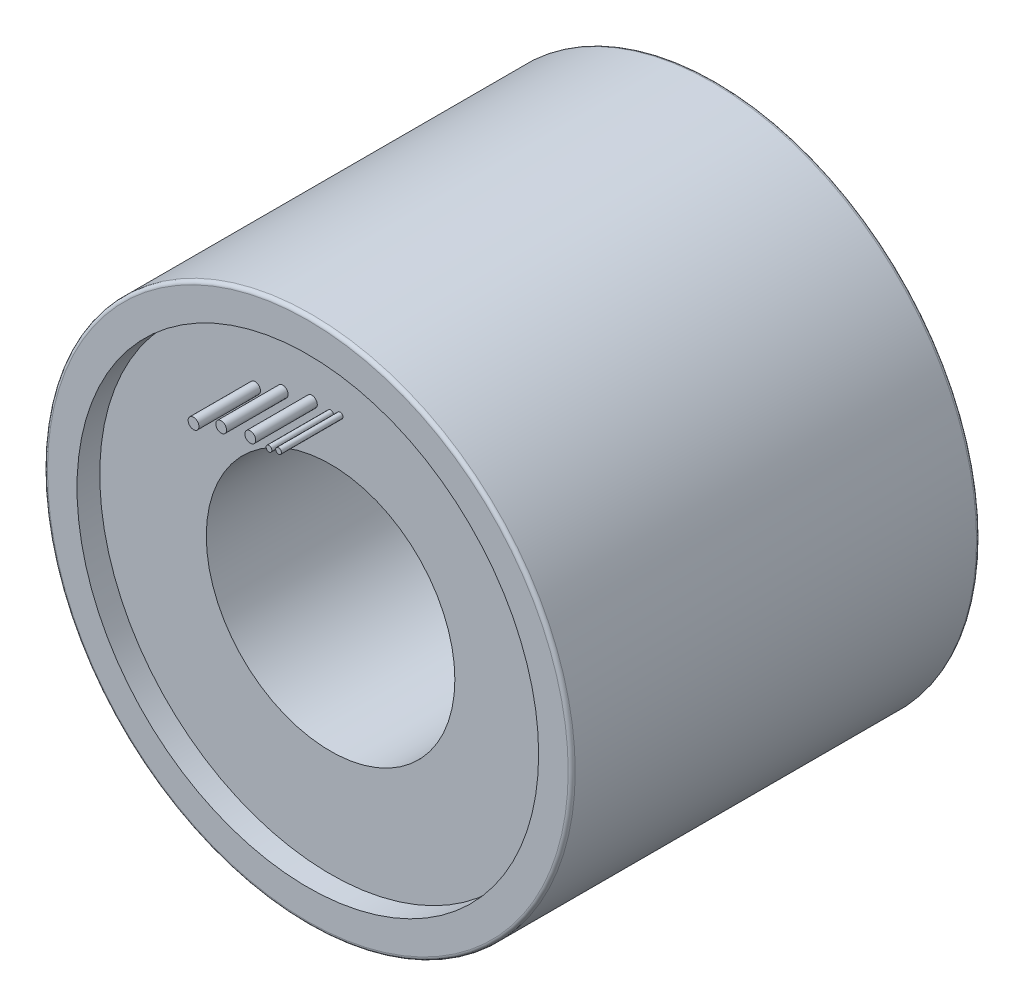
ISO-10303-21;
HEADER;
FILE_DESCRIPTION(('STEP AP214'),'2;1');
FILE_NAME('part.step','',(''),(''),'','','');
FILE_SCHEMA(('AUTOMOTIVE_DESIGN { 1 0 10303 214 1 1 1 1 }'));
ENDSEC;
DATA;
#1=APPLICATION_CONTEXT('core data for automotive mechanical design processes');
#2=APPLICATION_PROTOCOL_DEFINITION('international standard','automotive_design',2000,#1);
#3=PRODUCT_CONTEXT('',#1,'mechanical');
#4=PRODUCT('Part','Part','',(#3));
#5=PRODUCT_RELATED_PRODUCT_CATEGORY('part','',(#4));
#6=PRODUCT_DEFINITION_FORMATION('','',#4);
#7=PRODUCT_DEFINITION_CONTEXT('part definition',#1,'design');
#8=PRODUCT_DEFINITION('design','',#6,#7);
#9=PRODUCT_DEFINITION_SHAPE('','',#8);
#10=(LENGTH_UNIT() NAMED_UNIT(*) SI_UNIT(.MILLI.,.METRE.));
#11=(NAMED_UNIT(*) PLANE_ANGLE_UNIT() SI_UNIT($,.RADIAN.));
#12=(NAMED_UNIT(*) SI_UNIT($,.STERADIAN.) SOLID_ANGLE_UNIT());
#13=UNCERTAINTY_MEASURE_WITH_UNIT(LENGTH_MEASURE(1.E-05),#10,'distance_accuracy_value','');
#14=(GEOMETRIC_REPRESENTATION_CONTEXT(3) GLOBAL_UNCERTAINTY_ASSIGNED_CONTEXT((#13)) GLOBAL_UNIT_ASSIGNED_CONTEXT((#10,
#11,#12)) REPRESENTATION_CONTEXT('',''));
#15=CARTESIAN_POINT('',(0.,0.,0.));
#16=DIRECTION('',(0.,0.,1.));
#17=DIRECTION('',(1.,0.,0.));
#18=AXIS2_PLACEMENT_3D('',#15,#16,#17);
#19=CARTESIAN_POINT('',(0.,0.,58.));
#20=DIRECTION('',(0.,0.,-1.));
#21=DIRECTION('',(-1.,0.,0.));
#22=AXIS2_PLACEMENT_3D('',#19,#20,#21);
#23=CYLINDRICAL_SURFACE('',#22,37.4815);
#24=CARTESIAN_POINT('',(0.,0.,57.5));
#25=DIRECTION('',(0.,0.,1.));
#26=DIRECTION('',(1.,0.,0.));
#27=AXIS2_PLACEMENT_3D('',#24,#25,#26);
#28=CIRCLE('',#27,37.4815);
#29=CARTESIAN_POINT('',(-37.4815,0.,57.5));
#30=VERTEX_POINT('',#29);
#31=EDGE_CURVE('E42',#30,#30,#28,.F.);
#32=CARTESIAN_POINT('',(0.,0.,0.5));
#33=DIRECTION('',(0.,0.,1.));
#34=DIRECTION('',(1.,0.,0.));
#35=AXIS2_PLACEMENT_3D('',#32,#33,#34);
#36=CIRCLE('',#35,37.4815);
#37=CARTESIAN_POINT('',(-37.4815,0.,0.5));
#38=VERTEX_POINT('',#37);
#39=EDGE_CURVE('E46',#38,#38,#36,.T.);
#40=CARTESIAN_POINT('',(-37.4815,0.,57.5));
#41=CARTESIAN_POINT('',(-37.4815,0.,56.90625));
#42=CARTESIAN_POINT('',(-37.4815,0.,56.3125));
#43=CARTESIAN_POINT('',(-37.4815,0.,55.125));
#44=CARTESIAN_POINT('',(-37.4815,0.,54.53125));
#45=CARTESIAN_POINT('',(-37.4815,0.,53.34375));
#46=CARTESIAN_POINT('',(-37.4815,0.,52.75));
#47=CARTESIAN_POINT('',(-37.4815,0.,51.5625));
#48=CARTESIAN_POINT('',(-37.4815,0.,50.96875));
#49=CARTESIAN_POINT('',(-37.4815,0.,49.78125));
#50=CARTESIAN_POINT('',(-37.4815,0.,49.1875));
#51=CARTESIAN_POINT('',(-37.4815,0.,48.));
#52=CARTESIAN_POINT('',(-37.4815,0.,47.40625));
#53=CARTESIAN_POINT('',(-37.4815,0.,46.21875));
#54=CARTESIAN_POINT('',(-37.4815,0.,45.625));
#55=CARTESIAN_POINT('',(-37.4815,0.,44.4375));
#56=CARTESIAN_POINT('',(-37.4815,0.,43.84375));
#57=CARTESIAN_POINT('',(-37.4815,0.,42.65625));
#58=CARTESIAN_POINT('',(-37.4815,0.,42.0625));
#59=CARTESIAN_POINT('',(-37.4815,0.,40.875));
#60=CARTESIAN_POINT('',(-37.4815,0.,40.28125));
#61=CARTESIAN_POINT('',(-37.4815,0.,39.09375));
#62=CARTESIAN_POINT('',(-37.4815,0.,38.5));
#63=CARTESIAN_POINT('',(-37.4815,0.,37.3125));
#64=CARTESIAN_POINT('',(-37.4815,0.,36.71875));
#65=CARTESIAN_POINT('',(-37.4815,0.,35.53125));
#66=CARTESIAN_POINT('',(-37.4815,0.,34.9375));
#67=CARTESIAN_POINT('',(-37.4815,0.,33.75));
#68=CARTESIAN_POINT('',(-37.4815,0.,33.15625));
#69=CARTESIAN_POINT('',(-37.4815,0.,31.96875));
#70=CARTESIAN_POINT('',(-37.4815,0.,31.375));
#71=CARTESIAN_POINT('',(-37.4815,0.,30.1875));
#72=CARTESIAN_POINT('',(-37.4815,0.,29.59375));
#73=CARTESIAN_POINT('',(-37.4815,0.,28.40625));
#74=CARTESIAN_POINT('',(-37.4815,0.,27.8125));
#75=CARTESIAN_POINT('',(-37.4815,0.,26.625));
#76=CARTESIAN_POINT('',(-37.4815,0.,26.03125));
#77=CARTESIAN_POINT('',(-37.4815,0.,24.84375));
#78=CARTESIAN_POINT('',(-37.4815,0.,24.25));
#79=CARTESIAN_POINT('',(-37.4815,0.,23.0625));
#80=CARTESIAN_POINT('',(-37.4815,0.,22.46875));
#81=CARTESIAN_POINT('',(-37.4815,0.,21.28125));
#82=CARTESIAN_POINT('',(-37.4815,0.,20.6875));
#83=CARTESIAN_POINT('',(-37.4815,0.,19.5));
#84=CARTESIAN_POINT('',(-37.4815,0.,18.90625));
#85=CARTESIAN_POINT('',(-37.4815,0.,17.71875));
#86=CARTESIAN_POINT('',(-37.4815,0.,17.125));
#87=CARTESIAN_POINT('',(-37.4815,0.,15.9375));
#88=CARTESIAN_POINT('',(-37.4815,0.,15.34375));
#89=CARTESIAN_POINT('',(-37.4815,0.,14.15625));
#90=CARTESIAN_POINT('',(-37.4815,0.,13.5625));
#91=CARTESIAN_POINT('',(-37.4815,0.,12.375));
#92=CARTESIAN_POINT('',(-37.4815,0.,11.78125));
#93=CARTESIAN_POINT('',(-37.4815,0.,10.59375));
#94=CARTESIAN_POINT('',(-37.4815,0.,10.));
#95=CARTESIAN_POINT('',(-37.4815,0.,8.8125));
#96=CARTESIAN_POINT('',(-37.4815,0.,8.21875));
#97=CARTESIAN_POINT('',(-37.4815,0.,7.03124999999999));
#98=CARTESIAN_POINT('',(-37.4815,0.,6.43749999999999));
#99=CARTESIAN_POINT('',(-37.4815,0.,5.25));
#100=CARTESIAN_POINT('',(-37.4815,0.,4.65625));
#101=CARTESIAN_POINT('',(-37.4815,0.,3.46875));
#102=CARTESIAN_POINT('',(-37.4815,0.,2.875));
#103=CARTESIAN_POINT('',(-37.4815,0.,1.6875));
#104=CARTESIAN_POINT('',(-37.4815,0.,1.09375));
#105=CARTESIAN_POINT('',(-37.4815,0.,0.5));
#106=B_SPLINE_CURVE_WITH_KNOTS('',3,(#40,#41,#42,#43,#44,#45,#46,#47,#48,#49,#50,#51,#52,#53,
#54,#55,#56,#57,#58,#59,#60,#61,#62,#63,#64,#65,#66,#67,#68,#69,#70,#71,#72,#73,#74,#75,#76,#77,
#78,#79,#80,#81,#82,#83,#84,#85,#86,#87,#88,#89,#90,#91,#92,#93,#94,#95,#96,#97,#98,#99,#100,
#101,#102,#103,#104,#105),.UNSPECIFIED.,.F.,.F.,(4,2,2,2,2,2,2,2,2,2,2,2,2,2,2,2,2,2,2,2,2,2,2,
2,2,2,2,2,2,2,2,2,4),(0.,1.78125000000001,3.5625,5.34375,7.12500000000001,8.90625,10.6875,
12.46875,14.25,16.03125,17.8125,19.59375,21.375,23.15625,24.9375,26.71875,28.5,30.28125,32.0625,
33.84375,35.625,37.40625,39.1875,40.96875,42.75,44.53125,46.3125,48.09375,49.875,51.65625,
53.4375,55.21875,57.),.UNSPECIFIED.);
#107=EDGE_CURVE('BSEAM35',#30,#38,#106,.T.);
#108=ORIENTED_EDGE('',*,*,#31,.T.);
#109=ORIENTED_EDGE('',*,*,#39,.T.);
#110=ORIENTED_EDGE('',*,*,#107,.T.);
#111=ORIENTED_EDGE('',*,*,#107,.F.);
#112=EDGE_LOOP('',(#108,#110,#109,#111));
#113=FACE_BOUND('',#112,.T.);
#114=ADVANCED_FACE('F35',(#113),#23,.T.);
#115=CARTESIAN_POINT('',(0.,0.,58.));
#116=DIRECTION('',(0.,0.,1.));
#117=DIRECTION('',(1.,0.,0.));
#118=AXIS2_PLACEMENT_3D('',#115,#116,#117);
#119=PLANE('',#118);
#120=CARTESIAN_POINT('',(0.,0.,58.));
#121=DIRECTION('',(0.,0.,1.));
#122=DIRECTION('',(1.,0.,0.));
#123=AXIS2_PLACEMENT_3D('',#120,#121,#122);
#124=CIRCLE('',#123,36.9815);
#125=CARTESIAN_POINT('',(36.9815,0.,58.));
#126=VERTEX_POINT('',#125);
#127=EDGE_CURVE('E50',#126,#126,#124,.T.);
#128=ORIENTED_EDGE('',*,*,#127,.T.);
#129=EDGE_LOOP('',(#128));
#130=FACE_BOUND('',#129,.T.);
#131=CARTESIAN_POINT('',(0.,0.,58.));
#132=DIRECTION('',(0.,0.,1.));
#133=DIRECTION('',(1.,0.,0.));
#134=AXIS2_PLACEMENT_3D('',#131,#132,#133);
#135=CIRCLE('',#134,32.785);
#136=CARTESIAN_POINT('',(32.785,0.,58.));
#137=VERTEX_POINT('',#136);
#138=EDGE_CURVE('E59',#137,#137,#135,.T.);
#139=ORIENTED_EDGE('',*,*,#138,.F.);
#140=EDGE_LOOP('',(#139));
#141=FACE_BOUND('',#140,.T.);
#142=ADVANCED_FACE('F137',(#130,#141),#119,.T.);
#143=CARTESIAN_POINT('',(0.,0.,0.));
#144=DIRECTION('',(0.,0.,1.));
#145=DIRECTION('',(1.,0.,0.));
#146=AXIS2_PLACEMENT_3D('',#143,#144,#145);
#147=PLANE('',#146);
#148=CARTESIAN_POINT('',(0.,0.,0.));
#149=DIRECTION('',(0.,0.,1.));
#150=DIRECTION('',(1.,0.,0.));
#151=AXIS2_PLACEMENT_3D('',#148,#149,#150);
#152=CIRCLE('',#151,36.9815);
#153=CARTESIAN_POINT('',(36.9815,0.,0.));
#154=VERTEX_POINT('',#153);
#155=EDGE_CURVE('E10',#154,#154,#152,.F.);
#156=ORIENTED_EDGE('',*,*,#155,.T.);
#157=EDGE_LOOP('',(#156));
#158=FACE_BOUND('',#157,.T.);
#159=CARTESIAN_POINT('',(0.,0.,0.));
#160=DIRECTION('',(0.,0.,-1.));
#161=DIRECTION('',(-1.,0.,0.));
#162=AXIS2_PLACEMENT_3D('',#159,#160,#161);
#163=CIRCLE('',#162,32.785);
#164=CARTESIAN_POINT('',(-32.785,0.,0.));
#165=VERTEX_POINT('',#164);
#166=EDGE_CURVE('E61',#165,#165,#163,.T.);
#167=ORIENTED_EDGE('',*,*,#166,.F.);
#168=EDGE_LOOP('',(#167));
#169=FACE_BOUND('',#168,.T.);
#170=ADVANCED_FACE('F139',(#158,#169),#147,.F.);
#171=CARTESIAN_POINT('',(0.,0.,0.5));
#172=DIRECTION('',(0.,0.,-1.));
#173=DIRECTION('',(-1.,0.,0.));
#174=AXIS2_PLACEMENT_3D('',#171,#172,#173);
#175=CYLINDRICAL_SURFACE('',#174,32.785);
#176=CARTESIAN_POINT('',(0.,0.,0.5));
#177=DIRECTION('',(0.,0.,-1.));
#178=DIRECTION('',(-1.,0.,0.));
#179=AXIS2_PLACEMENT_3D('',#176,#177,#178);
#180=CIRCLE('',#179,32.785);
#181=CARTESIAN_POINT('',(-32.785,0.,0.5));
#182=VERTEX_POINT('',#181);
#183=EDGE_CURVE('E55',#182,#182,#180,.T.);
#184=ORIENTED_EDGE('',*,*,#183,.F.);
#185=EDGE_LOOP('',(#184));
#186=FACE_BOUND('',#185,.T.);
#187=ORIENTED_EDGE('',*,*,#166,.T.);
#188=EDGE_LOOP('',(#187));
#189=FACE_BOUND('',#188,.T.);
#190=ADVANCED_FACE('F146',(#186,#189),#175,.F.);
#191=CARTESIAN_POINT('',(0.,0.,0.5));
#192=DIRECTION('',(0.,0.,-1.));
#193=DIRECTION('',(-1.,0.,0.));
#194=AXIS2_PLACEMENT_3D('',#191,#192,#193);
#195=PLANE('',#194);
#196=CARTESIAN_POINT('',(0.,0.,0.5));
#197=DIRECTION('',(0.,0.,-1.));
#198=DIRECTION('',(-1.,0.,0.));
#199=AXIS2_PLACEMENT_3D('',#196,#197,#198);
#200=CIRCLE('',#199,17.655);
#201=CARTESIAN_POINT('',(-17.655,0.,0.5));
#202=VERTEX_POINT('',#201);
#203=EDGE_CURVE('E60',#202,#202,#200,.T.);
#204=ORIENTED_EDGE('',*,*,#203,.F.);
#205=EDGE_LOOP('',(#204));
#206=FACE_BOUND('',#205,.T.);
#207=ORIENTED_EDGE('',*,*,#183,.T.);
#208=EDGE_LOOP('',(#207));
#209=FACE_BOUND('',#208,.T.);
#210=ADVANCED_FACE('F133',(#206,#209),#195,.T.);
#211=CARTESIAN_POINT('',(0.,0.,54.77));
#212=DIRECTION('',(0.,0.,1.));
#213=DIRECTION('',(1.,0.,0.));
#214=AXIS2_PLACEMENT_3D('',#211,#212,#213);
#215=CYLINDRICAL_SURFACE('',#214,32.785);
#216=CARTESIAN_POINT('',(0.,0.,54.77));
#217=DIRECTION('',(0.,0.,1.));
#218=DIRECTION('',(1.,0.,0.));
#219=AXIS2_PLACEMENT_3D('',#216,#217,#218);
#220=CIRCLE('',#219,32.785);
#221=CARTESIAN_POINT('',(32.785,0.,54.77));
#222=VERTEX_POINT('',#221);
#223=EDGE_CURVE('E64',#222,#222,#220,.T.);
#224=ORIENTED_EDGE('',*,*,#223,.F.);
#225=EDGE_LOOP('',(#224));
#226=FACE_BOUND('',#225,.T.);
#227=ORIENTED_EDGE('',*,*,#138,.T.);
#228=EDGE_LOOP('',(#227));
#229=FACE_BOUND('',#228,.T.);
#230=ADVANCED_FACE('F117',(#226,#229),#215,.F.);
#231=CARTESIAN_POINT('',(0.,0.,54.77));
#232=DIRECTION('',(0.,0.,1.));
#233=DIRECTION('',(1.,0.,0.));
#234=AXIS2_PLACEMENT_3D('',#231,#232,#233);
#235=PLANE('',#234);
#236=CARTESIAN_POINT('',(1.35651285130451,24.3392276353266,54.77));
#237=DIRECTION('',(0.,0.,1.));
#238=DIRECTION('',(1.,0.,0.));
#239=AXIS2_PLACEMENT_3D('',#236,#237,#238);
#240=CIRCLE('',#239,0.4065);
#241=CARTESIAN_POINT('',(1.76301285130451,24.3392276353266,54.77));
#242=VERTEX_POINT('',#241);
#243=EDGE_CURVE('E98',#242,#242,#240,.T.);
#244=ORIENTED_EDGE('',*,*,#243,.F.);
#245=EDGE_LOOP('',(#244));
#246=FACE_BOUND('',#245,.T.);
#247=CARTESIAN_POINT('',(0.,23.9425,54.77));
#248=DIRECTION('',(0.,0.,1.));
#249=DIRECTION('',(1.,0.,0.));
#250=AXIS2_PLACEMENT_3D('',#247,#248,#249);
#251=CIRCLE('',#250,0.4065);
#252=CARTESIAN_POINT('',(0.4065,23.9425,54.77));
#253=VERTEX_POINT('',#252);
#254=EDGE_CURVE('E92',#253,#253,#251,.T.);
#255=ORIENTED_EDGE('',*,*,#254,.F.);
#256=EDGE_LOOP('',(#255));
#257=FACE_BOUND('',#256,.T.);
#258=CARTESIAN_POINT('',(-2.65065995288291,24.0478573695076,54.77));
#259=DIRECTION('',(0.,0.,1.));
#260=DIRECTION('',(1.,0.,0.));
#261=AXIS2_PLACEMENT_3D('',#258,#259,#260);
#262=CIRCLE('',#261,0.765999999999999);
#263=CARTESIAN_POINT('',(-1.88465995288291,24.0478573695076,54.77));
#264=VERTEX_POINT('',#263);
#265=EDGE_CURVE('E86',#264,#264,#262,.T.);
#266=ORIENTED_EDGE('',*,*,#265,.F.);
#267=EDGE_LOOP('',(#266));
#268=FACE_BOUND('',#267,.T.);
#269=CARTESIAN_POINT('',(-6.78625708120734,23.22223411039,54.77));
#270=DIRECTION('',(0.,0.,1.));
#271=DIRECTION('',(1.,0.,0.));
#272=AXIS2_PLACEMENT_3D('',#269,#270,#271);
#273=CIRCLE('',#272,0.765999999999998);
#274=CARTESIAN_POINT('',(-6.02025708120735,23.22223411039,54.77));
#275=VERTEX_POINT('',#274);
#276=EDGE_CURVE('E80',#275,#275,#273,.T.);
#277=ORIENTED_EDGE('',*,*,#276,.F.);
#278=EDGE_LOOP('',(#277));
#279=FACE_BOUND('',#278,.T.);
#280=CARTESIAN_POINT('',(-10.7156572221311,21.6910150188457,54.77));
#281=DIRECTION('',(0.,0.,1.));
#282=DIRECTION('',(1.,0.,0.));
#283=AXIS2_PLACEMENT_3D('',#280,#281,#282);
#284=CIRCLE('',#283,0.765999999999999);
#285=CARTESIAN_POINT('',(-9.94965722213107,21.6910150188457,54.77));
#286=VERTEX_POINT('',#285);
#287=EDGE_CURVE('E74',#286,#286,#284,.T.);
#288=ORIENTED_EDGE('',*,*,#287,.F.);
#289=EDGE_LOOP('',(#288));
#290=FACE_BOUND('',#289,.T.);
#291=CARTESIAN_POINT('',(0.,0.,54.77));
#292=DIRECTION('',(0.,0.,1.));
#293=DIRECTION('',(1.,0.,0.));
#294=AXIS2_PLACEMENT_3D('',#291,#292,#293);
#295=CIRCLE('',#294,17.655);
#296=CARTESIAN_POINT('',(17.655,0.,54.77));
#297=VERTEX_POINT('',#296);
#298=EDGE_CURVE('E56',#297,#297,#295,.T.);
#299=ORIENTED_EDGE('',*,*,#298,.F.);
#300=EDGE_LOOP('',(#299));
#301=FACE_BOUND('',#300,.T.);
#302=ORIENTED_EDGE('',*,*,#223,.T.);
#303=EDGE_LOOP('',(#302));
#304=FACE_BOUND('',#303,.T.);
#305=ADVANCED_FACE('F113',(#246,#257,#268,#279,#290,#301,#304),#235,.T.);
#306=CARTESIAN_POINT('',(0.,0.,58.));
#307=DIRECTION('',(0.,0.,-1.));
#308=DIRECTION('',(-1.,0.,0.));
#309=AXIS2_PLACEMENT_3D('',#306,#307,#308);
#310=CYLINDRICAL_SURFACE('',#309,17.655);
#311=ORIENTED_EDGE('',*,*,#298,.T.);
#312=EDGE_LOOP('',(#311));
#313=FACE_BOUND('',#312,.T.);
#314=ORIENTED_EDGE('',*,*,#203,.T.);
#315=EDGE_LOOP('',(#314));
#316=FACE_BOUND('',#315,.T.);
#317=ADVANCED_FACE('F116',(#313,#316),#310,.F.);
#318=CARTESIAN_POINT('',(-10.7156572221311,21.6910150188457,63.52));
#319=DIRECTION('',(0.,0.,-1.));
#320=DIRECTION('',(-1.,0.,0.));
#321=AXIS2_PLACEMENT_3D('',#318,#319,#320);
#322=CYLINDRICAL_SURFACE('',#321,0.765999999999999);
#323=CARTESIAN_POINT('',(-10.7156572221311,21.6910150188457,63.52));
#324=DIRECTION('',(0.,0.,1.));
#325=DIRECTION('',(1.,0.,0.));
#326=AXIS2_PLACEMENT_3D('',#323,#324,#325);
#327=CIRCLE('',#326,0.765999999999999);
#328=CARTESIAN_POINT('',(-9.94965722213107,21.6910150188457,63.52));
#329=VERTEX_POINT('',#328);
#330=EDGE_CURVE('E73',#329,#329,#327,.T.);
#331=ORIENTED_EDGE('',*,*,#330,.F.);
#332=EDGE_LOOP('',(#331));
#333=FACE_BOUND('',#332,.T.);
#334=ORIENTED_EDGE('',*,*,#287,.T.);
#335=EDGE_LOOP('',(#334));
#336=FACE_BOUND('',#335,.T.);
#337=ADVANCED_FACE('F191',(#333,#336),#322,.T.);
#338=CARTESIAN_POINT('',(-10.7156572221311,21.6910150188457,63.52));
#339=DIRECTION('',(0.,0.,1.));
#340=DIRECTION('',(1.,0.,0.));
#341=AXIS2_PLACEMENT_3D('',#338,#339,#340);
#342=PLANE('',#341);
#343=ORIENTED_EDGE('',*,*,#330,.T.);
#344=EDGE_LOOP('',(#343));
#345=FACE_BOUND('',#344,.T.);
#346=ADVANCED_FACE('F187',(#345),#342,.T.);
#347=CARTESIAN_POINT('',(-6.78625708120734,23.22223411039,63.52));
#348=DIRECTION('',(0.,0.,-1.));
#349=DIRECTION('',(-1.,0.,0.));
#350=AXIS2_PLACEMENT_3D('',#347,#348,#349);
#351=CYLINDRICAL_SURFACE('',#350,0.765999999999998);
#352=CARTESIAN_POINT('',(-6.78625708120734,23.22223411039,63.52));
#353=DIRECTION('',(0.,0.,1.));
#354=DIRECTION('',(1.,0.,0.));
#355=AXIS2_PLACEMENT_3D('',#352,#353,#354);
#356=CIRCLE('',#355,0.765999999999998);
#357=CARTESIAN_POINT('',(-6.02025708120735,23.22223411039,63.52));
#358=VERTEX_POINT('',#357);
#359=EDGE_CURVE('E77',#358,#358,#356,.T.);
#360=ORIENTED_EDGE('',*,*,#359,.F.);
#361=EDGE_LOOP('',(#360));
#362=FACE_BOUND('',#361,.T.);
#363=ORIENTED_EDGE('',*,*,#276,.T.);
#364=EDGE_LOOP('',(#363));
#365=FACE_BOUND('',#364,.T.);
#366=ADVANCED_FACE('F183',(#362,#365),#351,.T.);
#367=CARTESIAN_POINT('',(-6.78625708120734,23.22223411039,63.52));
#368=DIRECTION('',(0.,0.,1.));
#369=DIRECTION('',(1.,0.,0.));
#370=AXIS2_PLACEMENT_3D('',#367,#368,#369);
#371=PLANE('',#370);
#372=ORIENTED_EDGE('',*,*,#359,.T.);
#373=EDGE_LOOP('',(#372));
#374=FACE_BOUND('',#373,.T.);
#375=ADVANCED_FACE('F179',(#374),#371,.T.);
#376=CARTESIAN_POINT('',(-2.65065995288291,24.0478573695076,63.52));
#377=DIRECTION('',(0.,0.,-1.));
#378=DIRECTION('',(-1.,0.,0.));
#379=AXIS2_PLACEMENT_3D('',#376,#377,#378);
#380=CYLINDRICAL_SURFACE('',#379,0.765999999999999);
#381=CARTESIAN_POINT('',(-2.65065995288291,24.0478573695076,63.52));
#382=DIRECTION('',(0.,0.,1.));
#383=DIRECTION('',(1.,0.,0.));
#384=AXIS2_PLACEMENT_3D('',#381,#382,#383);
#385=CIRCLE('',#384,0.765999999999999);
#386=CARTESIAN_POINT('',(-1.88465995288291,24.0478573695076,63.52));
#387=VERTEX_POINT('',#386);
#388=EDGE_CURVE('E83',#387,#387,#385,.T.);
#389=ORIENTED_EDGE('',*,*,#388,.F.);
#390=EDGE_LOOP('',(#389));
#391=FACE_BOUND('',#390,.T.);
#392=ORIENTED_EDGE('',*,*,#265,.T.);
#393=EDGE_LOOP('',(#392));
#394=FACE_BOUND('',#393,.T.);
#395=ADVANCED_FACE('F175',(#391,#394),#380,.T.);
#396=CARTESIAN_POINT('',(-2.65065995288291,24.0478573695076,63.52));
#397=DIRECTION('',(0.,0.,1.));
#398=DIRECTION('',(1.,0.,0.));
#399=AXIS2_PLACEMENT_3D('',#396,#397,#398);
#400=PLANE('',#399);
#401=ORIENTED_EDGE('',*,*,#388,.T.);
#402=EDGE_LOOP('',(#401));
#403=FACE_BOUND('',#402,.T.);
#404=ADVANCED_FACE('F171',(#403),#400,.T.);
#405=CARTESIAN_POINT('',(0.,23.9425,63.52));
#406=DIRECTION('',(0.,0.,-1.));
#407=DIRECTION('',(-1.,0.,0.));
#408=AXIS2_PLACEMENT_3D('',#405,#406,#407);
#409=CYLINDRICAL_SURFACE('',#408,0.4065);
#410=CARTESIAN_POINT('',(0.,23.9425,63.52));
#411=DIRECTION('',(0.,0.,1.));
#412=DIRECTION('',(1.,0.,0.));
#413=AXIS2_PLACEMENT_3D('',#410,#411,#412);
#414=CIRCLE('',#413,0.4065);
#415=CARTESIAN_POINT('',(0.4065,23.9425,63.52));
#416=VERTEX_POINT('',#415);
#417=EDGE_CURVE('E89',#416,#416,#414,.T.);
#418=ORIENTED_EDGE('',*,*,#417,.F.);
#419=EDGE_LOOP('',(#418));
#420=FACE_BOUND('',#419,.T.);
#421=ORIENTED_EDGE('',*,*,#254,.T.);
#422=EDGE_LOOP('',(#421));
#423=FACE_BOUND('',#422,.T.);
#424=ADVANCED_FACE('F167',(#420,#423),#409,.T.);
#425=CARTESIAN_POINT('',(0.,23.9425,63.52));
#426=DIRECTION('',(0.,0.,1.));
#427=DIRECTION('',(1.,0.,0.));
#428=AXIS2_PLACEMENT_3D('',#425,#426,#427);
#429=PLANE('',#428);
#430=ORIENTED_EDGE('',*,*,#417,.T.);
#431=EDGE_LOOP('',(#430));
#432=FACE_BOUND('',#431,.T.);
#433=ADVANCED_FACE('F109',(#432),#429,.T.);
#434=CARTESIAN_POINT('',(1.35651285130451,24.3392276353266,63.52));
#435=DIRECTION('',(0.,0.,-1.));
#436=DIRECTION('',(-1.,0.,0.));
#437=AXIS2_PLACEMENT_3D('',#434,#435,#436);
#438=CYLINDRICAL_SURFACE('',#437,0.4065);
#439=CARTESIAN_POINT('',(1.35651285130451,24.3392276353266,63.52));
#440=DIRECTION('',(0.,0.,1.));
#441=DIRECTION('',(1.,0.,0.));
#442=AXIS2_PLACEMENT_3D('',#439,#440,#441);
#443=CIRCLE('',#442,0.4065);
#444=CARTESIAN_POINT('',(1.76301285130451,24.3392276353266,63.52));
#445=VERTEX_POINT('',#444);
#446=EDGE_CURVE('E95',#445,#445,#443,.T.);
#447=ORIENTED_EDGE('',*,*,#446,.F.);
#448=EDGE_LOOP('',(#447));
#449=FACE_BOUND('',#448,.T.);
#450=ORIENTED_EDGE('',*,*,#243,.T.);
#451=EDGE_LOOP('',(#450));
#452=FACE_BOUND('',#451,.T.);
#453=ADVANCED_FACE('F106',(#449,#452),#438,.T.);
#454=CARTESIAN_POINT('',(1.35651285130451,24.3392276353266,63.52));
#455=DIRECTION('',(0.,0.,1.));
#456=DIRECTION('',(1.,0.,0.));
#457=AXIS2_PLACEMENT_3D('',#454,#455,#456);
#458=PLANE('',#457);
#459=ORIENTED_EDGE('',*,*,#446,.T.);
#460=EDGE_LOOP('',(#459));
#461=FACE_BOUND('',#460,.T.);
#462=ADVANCED_FACE('F104',(#461),#458,.T.);
#463=CARTESIAN_POINT('',(0.,0.,57.5));
#464=DIRECTION('',(0.,0.,1.));
#465=DIRECTION('',(1.,0.,0.));
#466=AXIS2_PLACEMENT_3D('',#463,#464,#465);
#467=TOROIDAL_SURFACE('',#466,36.9815,0.5);
#468=ORIENTED_EDGE('',*,*,#31,.F.);
#469=EDGE_LOOP('',(#468));
#470=FACE_BOUND('',#469,.T.);
#471=ORIENTED_EDGE('',*,*,#127,.F.);
#472=EDGE_LOOP('',(#471));
#473=FACE_BOUND('',#472,.T.);
#474=ADVANCED_FACE('F151',(#470,#473),#467,.T.);
#475=CARTESIAN_POINT('',(0.,0.,0.5));
#476=DIRECTION('',(0.,0.,1.));
#477=DIRECTION('',(1.,0.,0.));
#478=AXIS2_PLACEMENT_3D('',#475,#476,#477);
#479=TOROIDAL_SURFACE('',#478,36.9815,0.5);
#480=ORIENTED_EDGE('',*,*,#155,.F.);
#481=EDGE_LOOP('',(#480));
#482=FACE_BOUND('',#481,.T.);
#483=ORIENTED_EDGE('',*,*,#39,.F.);
#484=EDGE_LOOP('',(#483));
#485=FACE_BOUND('',#484,.T.);
#486=ADVANCED_FACE('F37',(#482,#485),#479,.T.);
#487=CLOSED_SHELL('',(#114,#142,#170,#190,#210,#230,#305,#317,#337,#346,#366,#375,#395,#404,
#424,#433,#453,#462,#474,#486));
#488=MANIFOLD_SOLID_BREP('B2',#487);
#489=ADVANCED_BREP_SHAPE_REPRESENTATION('',(#18,#488),#14);
#490=SHAPE_DEFINITION_REPRESENTATION(#9,#489);
ENDSEC;
END-ISO-10303-21;
